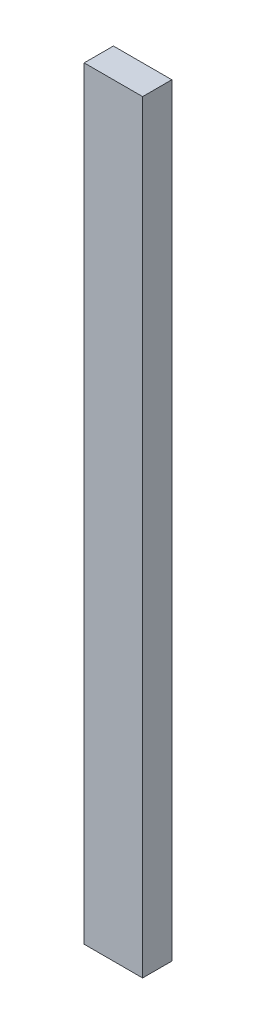
ISO-10303-21;
HEADER;
FILE_DESCRIPTION(('STEP AP214'),'2;1');
FILE_NAME('part.step','',(''),(''),'','','');
FILE_SCHEMA(('AUTOMOTIVE_DESIGN { 1 0 10303 214 1 1 1 1 }'));
ENDSEC;
DATA;
#1=APPLICATION_CONTEXT('core data for automotive mechanical design processes');
#2=APPLICATION_PROTOCOL_DEFINITION('international standard','automotive_design',2000,#1);
#3=PRODUCT_CONTEXT('',#1,'mechanical');
#4=PRODUCT('Part','Part','',(#3));
#5=PRODUCT_RELATED_PRODUCT_CATEGORY('part','',(#4));
#6=PRODUCT_DEFINITION_FORMATION('','',#4);
#7=PRODUCT_DEFINITION_CONTEXT('part definition',#1,'design');
#8=PRODUCT_DEFINITION('design','',#6,#7);
#9=PRODUCT_DEFINITION_SHAPE('','',#8);
#10=(LENGTH_UNIT() NAMED_UNIT(*) SI_UNIT(.MILLI.,.METRE.));
#11=(NAMED_UNIT(*) PLANE_ANGLE_UNIT() SI_UNIT($,.RADIAN.));
#12=(NAMED_UNIT(*) SI_UNIT($,.STERADIAN.) SOLID_ANGLE_UNIT());
#13=UNCERTAINTY_MEASURE_WITH_UNIT(LENGTH_MEASURE(1.E-05),#10,'distance_accuracy_value','');
#14=(GEOMETRIC_REPRESENTATION_CONTEXT(3) GLOBAL_UNCERTAINTY_ASSIGNED_CONTEXT((#13)) GLOBAL_UNIT_ASSIGNED_CONTEXT((#10,
#11,#12)) REPRESENTATION_CONTEXT('',''));
#15=CARTESIAN_POINT('',(0.,0.,0.));
#16=DIRECTION('',(0.,0.,1.));
#17=DIRECTION('',(1.,0.,0.));
#18=AXIS2_PLACEMENT_3D('',#15,#16,#17);
#19=CARTESIAN_POINT('',(24.,-313.5,24.0000000000001));
#20=DIRECTION('',(-1.,0.,0.));
#21=DIRECTION('',(0.,0.,1.));
#22=AXIS2_PLACEMENT_3D('',#19,#20,#21);
#23=PLANE('',#22);
#24=DIRECTION('',(0.,1.,0.));
#25=VECTOR('',#24,1.);
#26=CARTESIAN_POINT('',(24.,-313.5,0.));
#27=LINE('',#26,#25);
#28=CARTESIAN_POINT('',(24.,-313.5,0.));
#29=VERTEX_POINT('',#28);
#30=CARTESIAN_POINT('',(24.0000000000002,313.5,0.));
#31=VERTEX_POINT('',#30);
#32=EDGE_CURVE('E110',#29,#31,#27,.T.);
#33=ORIENTED_EDGE('',*,*,#32,.T.);
#34=DIRECTION('',(0.,0.,-1.));
#35=VECTOR('',#34,1.);
#36=CARTESIAN_POINT('',(24.,313.5,23.9999999999999));
#37=LINE('',#36,#35);
#38=CARTESIAN_POINT('',(24.,313.5,23.9999999999999));
#39=VERTEX_POINT('',#38);
#40=EDGE_CURVE('E11',#39,#31,#37,.T.);
#41=ORIENTED_EDGE('',*,*,#40,.F.);
#42=DIRECTION('',(0.,1.,0.));
#43=VECTOR('',#42,1.);
#44=CARTESIAN_POINT('',(24.,-313.5,24.0000000000001));
#45=LINE('',#44,#43);
#46=CARTESIAN_POINT('',(24.,-313.5,24.0000000000001));
#47=VERTEX_POINT('',#46);
#48=EDGE_CURVE('E93',#47,#39,#45,.T.);
#49=ORIENTED_EDGE('',*,*,#48,.F.);
#50=DIRECTION('',(0.,0.,-1.));
#51=VECTOR('',#50,1.);
#52=CARTESIAN_POINT('',(24.,-313.5,24.0000000000001));
#53=LINE('',#52,#51);
#54=EDGE_CURVE('E106',#47,#29,#53,.T.);
#55=ORIENTED_EDGE('',*,*,#54,.T.);
#56=EDGE_LOOP('',(#33,#41,#49,#55));
#57=FACE_BOUND('',#56,.T.);
#58=ADVANCED_FACE('F41',(#57),#23,.F.);
#59=CARTESIAN_POINT('',(-24.,313.5,24.0000000000001));
#60=DIRECTION('',(0.,-1.,0.));
#61=DIRECTION('',(0.,0.,-1.));
#62=AXIS2_PLACEMENT_3D('',#59,#60,#61);
#63=PLANE('',#62);
#64=DIRECTION('',(-1.,0.,0.));
#65=VECTOR('',#64,1.);
#66=CARTESIAN_POINT('',(-24.,313.5,0.));
#67=LINE('',#66,#65);
#68=CARTESIAN_POINT('',(-24.,313.5,0.));
#69=VERTEX_POINT('',#68);
#70=EDGE_CURVE('E98',#31,#69,#67,.T.);
#71=ORIENTED_EDGE('',*,*,#70,.T.);
#72=DIRECTION('',(0.,0.,-1.));
#73=VECTOR('',#72,1.);
#74=CARTESIAN_POINT('',(-24.,313.5,24.0000000000001));
#75=LINE('',#74,#73);
#76=CARTESIAN_POINT('',(-24.,313.5,24.0000000000001));
#77=VERTEX_POINT('',#76);
#78=EDGE_CURVE('E50',#77,#69,#75,.T.);
#79=ORIENTED_EDGE('',*,*,#78,.F.);
#80=DIRECTION('',(-1.,0.,0.));
#81=VECTOR('',#80,1.);
#82=CARTESIAN_POINT('',(-24.,313.5,24.0000000000001));
#83=LINE('',#82,#81);
#84=EDGE_CURVE('E88',#39,#77,#83,.T.);
#85=ORIENTED_EDGE('',*,*,#84,.F.);
#86=ORIENTED_EDGE('',*,*,#40,.T.);
#87=EDGE_LOOP('',(#71,#79,#85,#86));
#88=FACE_BOUND('',#87,.T.);
#89=ADVANCED_FACE('F97',(#88),#63,.F.);
#90=CARTESIAN_POINT('',(-24.0000000000001,-313.5,24.0000000000001));
#91=DIRECTION('',(1.,0.,0.));
#92=DIRECTION('',(0.,0.,-1.));
#93=AXIS2_PLACEMENT_3D('',#90,#91,#92);
#94=PLANE('',#93);
#95=DIRECTION('',(0.,-1.,0.));
#96=VECTOR('',#95,1.);
#97=CARTESIAN_POINT('',(-24.0000000000001,-313.5,0.));
#98=LINE('',#97,#96);
#99=CARTESIAN_POINT('',(-24.0000000000001,-313.5,0.));
#100=VERTEX_POINT('',#99);
#101=EDGE_CURVE('E75',#69,#100,#98,.T.);
#102=ORIENTED_EDGE('',*,*,#101,.T.);
#103=DIRECTION('',(0.,0.,-1.));
#104=VECTOR('',#103,1.);
#105=CARTESIAN_POINT('',(-24.0000000000001,-313.5,24.0000000000001));
#106=LINE('',#105,#104);
#107=CARTESIAN_POINT('',(-24.0000000000001,-313.5,24.0000000000001));
#108=VERTEX_POINT('',#107);
#109=EDGE_CURVE('E100',#108,#100,#106,.T.);
#110=ORIENTED_EDGE('',*,*,#109,.F.);
#111=DIRECTION('',(0.,-1.,0.));
#112=VECTOR('',#111,1.);
#113=CARTESIAN_POINT('',(-24.0000000000001,-313.5,24.0000000000001));
#114=LINE('',#113,#112);
#115=EDGE_CURVE('E91',#77,#108,#114,.T.);
#116=ORIENTED_EDGE('',*,*,#115,.F.);
#117=ORIENTED_EDGE('',*,*,#78,.T.);
#118=EDGE_LOOP('',(#102,#110,#116,#117));
#119=FACE_BOUND('',#118,.T.);
#120=ADVANCED_FACE('F101',(#119),#94,.F.);
#121=CARTESIAN_POINT('',(-24.0000000000001,-313.5,24.0000000000001));
#122=DIRECTION('',(0.,1.,0.));
#123=DIRECTION('',(0.,0.,1.));
#124=AXIS2_PLACEMENT_3D('',#121,#122,#123);
#125=PLANE('',#124);
#126=DIRECTION('',(1.,0.,0.));
#127=VECTOR('',#126,1.);
#128=CARTESIAN_POINT('',(-24.0000000000001,-313.5,0.));
#129=LINE('',#128,#127);
#130=EDGE_CURVE('E81',#100,#29,#129,.T.);
#131=ORIENTED_EDGE('',*,*,#130,.T.);
#132=ORIENTED_EDGE('',*,*,#54,.F.);
#133=DIRECTION('',(1.,0.,0.));
#134=VECTOR('',#133,1.);
#135=CARTESIAN_POINT('',(-24.0000000000001,-313.5,24.0000000000001));
#136=LINE('',#135,#134);
#137=EDGE_CURVE('E58',#108,#47,#136,.T.);
#138=ORIENTED_EDGE('',*,*,#137,.F.);
#139=ORIENTED_EDGE('',*,*,#109,.T.);
#140=EDGE_LOOP('',(#131,#132,#138,#139));
#141=FACE_BOUND('',#140,.T.);
#142=ADVANCED_FACE('F124',(#141),#125,.F.);
#143=CARTESIAN_POINT('',(0.,-1.11022302462516E-13,24.));
#144=DIRECTION('',(0.,0.,-1.));
#145=DIRECTION('',(-1.,0.,0.));
#146=AXIS2_PLACEMENT_3D('',#143,#144,#145);
#147=PLANE('',#146);
#148=ORIENTED_EDGE('',*,*,#48,.T.);
#149=ORIENTED_EDGE('',*,*,#84,.T.);
#150=ORIENTED_EDGE('',*,*,#115,.T.);
#151=ORIENTED_EDGE('',*,*,#137,.T.);
#152=EDGE_LOOP('',(#148,#149,#150,#151));
#153=FACE_BOUND('',#152,.T.);
#154=ADVANCED_FACE('F89',(#153),#147,.F.);
#155=CARTESIAN_POINT('',(0.,0.,0.));
#156=DIRECTION('',(0.,0.,-1.));
#157=DIRECTION('',(-1.,0.,0.));
#158=AXIS2_PLACEMENT_3D('',#155,#156,#157);
#159=PLANE('',#158);
#160=ORIENTED_EDGE('',*,*,#32,.F.);
#161=ORIENTED_EDGE('',*,*,#130,.F.);
#162=ORIENTED_EDGE('',*,*,#101,.F.);
#163=ORIENTED_EDGE('',*,*,#70,.F.);
#164=EDGE_LOOP('',(#160,#161,#162,#163));
#165=FACE_BOUND('',#164,.T.);
#166=ADVANCED_FACE('F127',(#165),#159,.T.);
#167=CLOSED_SHELL('',(#58,#89,#120,#142,#154,#166));
#168=MANIFOLD_SOLID_BREP('B2',#167);
#169=ADVANCED_BREP_SHAPE_REPRESENTATION('',(#18,#168),#14);
#170=SHAPE_DEFINITION_REPRESENTATION(#9,#169);
ENDSEC;
END-ISO-10303-21;
